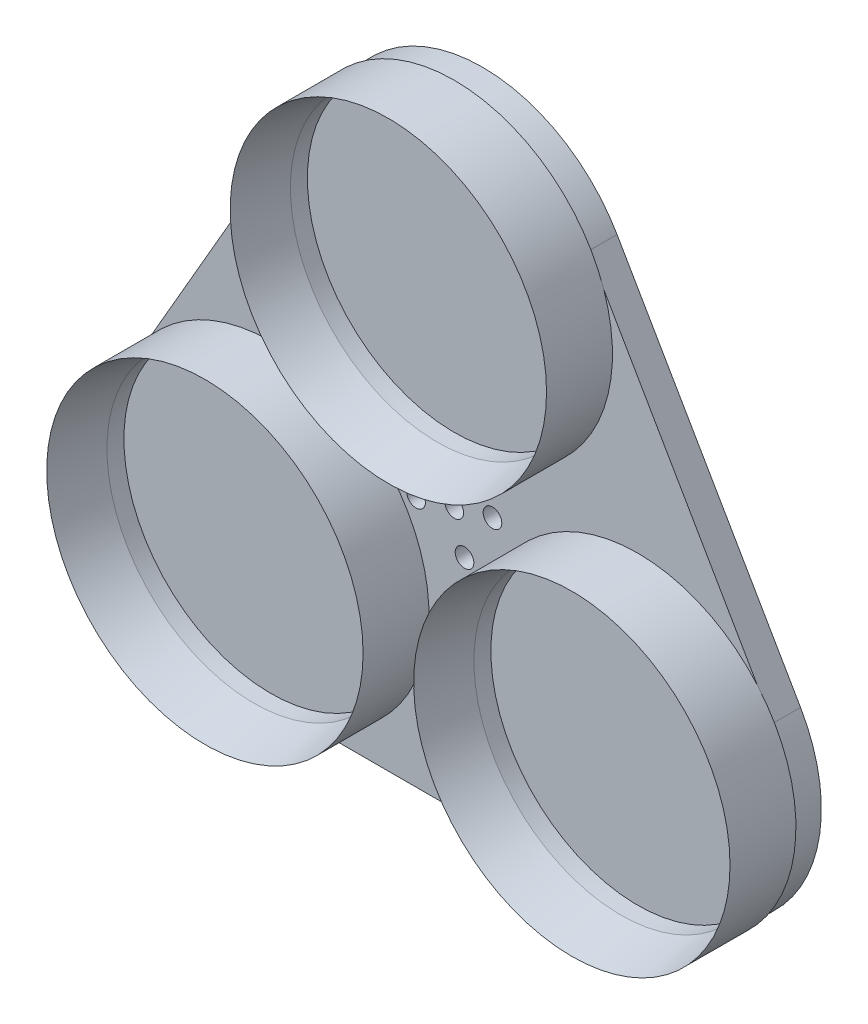
ISO-10303-21;
HEADER;
FILE_DESCRIPTION(('STEP AP214'),'2;1');
FILE_NAME('part.step','',(''),(''),'','','');
FILE_SCHEMA(('AUTOMOTIVE_DESIGN { 1 0 10303 214 1 1 1 1 }'));
ENDSEC;
DATA;
#1=APPLICATION_CONTEXT('core data for automotive mechanical design processes');
#2=APPLICATION_PROTOCOL_DEFINITION('international standard','automotive_design',2000,#1);
#3=PRODUCT_CONTEXT('',#1,'mechanical');
#4=PRODUCT('Part','Part','',(#3));
#5=PRODUCT_RELATED_PRODUCT_CATEGORY('part','',(#4));
#6=PRODUCT_DEFINITION_FORMATION('','',#4);
#7=PRODUCT_DEFINITION_CONTEXT('part definition',#1,'design');
#8=PRODUCT_DEFINITION('design','',#6,#7);
#9=PRODUCT_DEFINITION_SHAPE('','',#8);
#10=(LENGTH_UNIT() NAMED_UNIT(*) SI_UNIT(.MILLI.,.METRE.));
#11=(NAMED_UNIT(*) PLANE_ANGLE_UNIT() SI_UNIT($,.RADIAN.));
#12=(NAMED_UNIT(*) SI_UNIT($,.STERADIAN.) SOLID_ANGLE_UNIT());
#13=UNCERTAINTY_MEASURE_WITH_UNIT(LENGTH_MEASURE(1.E-05),#10,'distance_accuracy_value','');
#14=(GEOMETRIC_REPRESENTATION_CONTEXT(3) GLOBAL_UNCERTAINTY_ASSIGNED_CONTEXT((#13)) GLOBAL_UNIT_ASSIGNED_CONTEXT((#10,
#11,#12)) REPRESENTATION_CONTEXT('',''));
#15=CARTESIAN_POINT('',(0.,0.,0.));
#16=DIRECTION('',(0.,0.,1.));
#17=DIRECTION('',(1.,0.,0.));
#18=AXIS2_PLACEMENT_3D('',#15,#16,#17);
#19=CARTESIAN_POINT('',(0.,37.5,5.));
#20=DIRECTION('',(0.,0.,-1.));
#21=DIRECTION('',(-1.,0.,0.));
#22=AXIS2_PLACEMENT_3D('',#19,#20,#21);
#23=CYLINDRICAL_SURFACE('',#22,27.5);
#24=CARTESIAN_POINT('',(0.,37.5,0.));
#25=DIRECTION('',(0.,0.,1.));
#26=DIRECTION('',(1.,0.,0.));
#27=AXIS2_PLACEMENT_3D('',#24,#25,#26);
#28=CIRCLE('',#27,27.5);
#29=CARTESIAN_POINT('',(23.8156986040722,51.25,0.));
#30=VERTEX_POINT('',#29);
#31=CARTESIAN_POINT('',(-23.8156986040719,51.25,0.));
#32=VERTEX_POINT('',#31);
#33=EDGE_CURVE('E160',#30,#32,#28,.T.);
#34=ORIENTED_EDGE('',*,*,#33,.T.);
#35=DIRECTION('',(0.,0.,-1.));
#36=VECTOR('',#35,1.);
#37=CARTESIAN_POINT('',(-23.8156986040719,51.25,5.));
#38=LINE('',#37,#36);
#39=CARTESIAN_POINT('',(-23.8156986040719,51.25,5.));
#40=VERTEX_POINT('',#39);
#41=EDGE_CURVE('E186',#40,#32,#38,.T.);
#42=ORIENTED_EDGE('',*,*,#41,.F.);
#43=CARTESIAN_POINT('',(0.,37.5,5.));
#44=DIRECTION('',(0.,0.,1.));
#45=DIRECTION('',(1.,0.,0.));
#46=AXIS2_PLACEMENT_3D('',#43,#44,#45);
#47=CIRCLE('',#46,27.5);
#48=CARTESIAN_POINT('',(23.8156986040722,51.25,5.));
#49=VERTEX_POINT('',#48);
#50=EDGE_CURVE('E139',#49,#40,#47,.T.);
#51=ORIENTED_EDGE('',*,*,#50,.F.);
#52=DIRECTION('',(0.,0.,-1.));
#53=VECTOR('',#52,1.);
#54=CARTESIAN_POINT('',(23.8156986040722,51.25,5.));
#55=LINE('',#54,#53);
#56=EDGE_CURVE('E158',#49,#30,#55,.T.);
#57=ORIENTED_EDGE('',*,*,#56,.T.);
#58=EDGE_LOOP('',(#34,#42,#51,#57));
#59=FACE_BOUND('',#58,.T.);
#60=ADVANCED_FACE('F43',(#59),#23,.T.);
#61=CARTESIAN_POINT('',(-23.8156986040719,51.25,5.));
#62=DIRECTION('',(0.866025403784439,-0.5,0.));
#63=DIRECTION('',(0.5,0.866025403784439,0.));
#64=AXIS2_PLACEMENT_3D('',#61,#62,#63);
#65=PLANE('',#64);
#66=DIRECTION('',(-0.5,-0.866025403784439,0.));
#67=VECTOR('',#66,1.);
#68=CARTESIAN_POINT('',(-23.8156986040719,51.25,0.));
#69=LINE('',#68,#67);
#70=CARTESIAN_POINT('',(-56.2916512459884,-5.00000000000011,0.));
#71=VERTEX_POINT('',#70);
#72=EDGE_CURVE('E163',#32,#71,#69,.T.);
#73=ORIENTED_EDGE('',*,*,#72,.T.);
#74=DIRECTION('',(0.,0.,-1.));
#75=VECTOR('',#74,1.);
#76=CARTESIAN_POINT('',(-56.2916512459884,-5.00000000000011,5.));
#77=LINE('',#76,#75);
#78=CARTESIAN_POINT('',(-56.2916512459884,-5.0000000000001,5.));
#79=VERTEX_POINT('',#78);
#80=EDGE_CURVE('E137',#79,#71,#77,.T.);
#81=ORIENTED_EDGE('',*,*,#80,.F.);
#82=DIRECTION('',(-0.5,-0.866025403784439,0.));
#83=VECTOR('',#82,1.);
#84=CARTESIAN_POINT('',(-23.8156986040719,51.25,5.));
#85=LINE('',#84,#83);
#86=CARTESIAN_POINT('',(-53.6577378077752,-0.437928102276289,5.));
#87=VERTEX_POINT('',#86);
#88=EDGE_CURVE('E125',#87,#79,#85,.T.);
#89=ORIENTED_EDGE('',*,*,#88,.F.);
#90=CARTESIAN_POINT('',(-26.4496120422853,46.6879281022761,5.));
#91=VERTEX_POINT('',#90);
#92=EDGE_CURVE('E134',#91,#87,#85,.T.);
#93=ORIENTED_EDGE('',*,*,#92,.F.);
#94=EDGE_CURVE('E141',#40,#91,#85,.T.);
#95=ORIENTED_EDGE('',*,*,#94,.F.);
#96=ORIENTED_EDGE('',*,*,#41,.T.);
#97=EDGE_LOOP('',(#73,#81,#89,#93,#95,#96));
#98=FACE_BOUND('',#97,.T.);
#99=ADVANCED_FACE('F133',(#98),#65,.F.);
#100=CARTESIAN_POINT('',(-32.4759526419164,-18.7500000000001,5.));
#101=DIRECTION('',(0.,0.,-1.));
#102=DIRECTION('',(-1.,0.,0.));
#103=AXIS2_PLACEMENT_3D('',#100,#101,#102);
#104=CYLINDRICAL_SURFACE('',#103,27.5);
#105=CARTESIAN_POINT('',(-32.4759526419164,-18.7500000000001,0.));
#106=DIRECTION('',(0.,0.,1.));
#107=DIRECTION('',(1.,0.,0.));
#108=AXIS2_PLACEMENT_3D('',#105,#106,#107);
#109=CIRCLE('',#108,27.5);
#110=CARTESIAN_POINT('',(-32.4759526419164,-46.2500000000001,0.));
#111=VERTEX_POINT('',#110);
#112=EDGE_CURVE('E166',#71,#111,#109,.T.);
#113=ORIENTED_EDGE('',*,*,#112,.T.);
#114=DIRECTION('',(0.,0.,-1.));
#115=VECTOR('',#114,1.);
#116=CARTESIAN_POINT('',(-32.4759526419164,-46.2500000000001,5.));
#117=LINE('',#116,#115);
#118=CARTESIAN_POINT('',(-32.4759526419164,-46.2500000000001,5.));
#119=VERTEX_POINT('',#118);
#120=EDGE_CURVE('E182',#119,#111,#117,.T.);
#121=ORIENTED_EDGE('',*,*,#120,.F.);
#122=CARTESIAN_POINT('',(-32.4759526419164,-18.7500000000001,5.));
#123=DIRECTION('',(0.,0.,1.));
#124=DIRECTION('',(1.,0.,0.));
#125=AXIS2_PLACEMENT_3D('',#122,#123,#124);
#126=CIRCLE('',#125,27.5);
#127=EDGE_CURVE('E145',#79,#119,#126,.T.);
#128=ORIENTED_EDGE('',*,*,#127,.F.);
#129=ORIENTED_EDGE('',*,*,#80,.T.);
#130=EDGE_LOOP('',(#113,#121,#128,#129));
#131=FACE_BOUND('',#130,.T.);
#132=ADVANCED_FACE('F225',(#131),#104,.T.);
#133=CARTESIAN_POINT('',(-32.4759526419164,-46.2500000000001,5.));
#134=DIRECTION('',(0.,1.,0.));
#135=DIRECTION('',(-1.,0.,0.));
#136=AXIS2_PLACEMENT_3D('',#133,#134,#135);
#137=PLANE('',#136);
#138=DIRECTION('',(1.,0.,0.));
#139=VECTOR('',#138,1.);
#140=CARTESIAN_POINT('',(-32.4759526419164,-46.2500000000001,0.));
#141=LINE('',#140,#139);
#142=CARTESIAN_POINT('',(32.4759526419164,-46.25,0.));
#143=VERTEX_POINT('',#142);
#144=EDGE_CURVE('E168',#111,#143,#141,.T.);
#145=ORIENTED_EDGE('',*,*,#144,.T.);
#146=DIRECTION('',(0.,0.,-1.));
#147=VECTOR('',#146,1.);
#148=CARTESIAN_POINT('',(32.4759526419164,-46.25,5.));
#149=LINE('',#148,#147);
#150=CARTESIAN_POINT('',(32.4759526419164,-46.25,5.));
#151=VERTEX_POINT('',#150);
#152=EDGE_CURVE('E179',#151,#143,#149,.T.);
#153=ORIENTED_EDGE('',*,*,#152,.F.);
#154=DIRECTION('',(1.,0.,0.));
#155=VECTOR('',#154,1.);
#156=CARTESIAN_POINT('',(-32.4759526419164,-46.2500000000001,5.));
#157=LINE('',#156,#155);
#158=CARTESIAN_POINT('',(27.20812576549,-46.25,5.));
#159=VERTEX_POINT('',#158);
#160=EDGE_CURVE('E150',#159,#151,#157,.T.);
#161=ORIENTED_EDGE('',*,*,#160,.F.);
#162=CARTESIAN_POINT('',(-27.20812576549,-46.2500000000001,5.));
#163=VERTEX_POINT('',#162);
#164=EDGE_CURVE('E153',#163,#159,#157,.T.);
#165=ORIENTED_EDGE('',*,*,#164,.F.);
#166=EDGE_CURVE('E128',#119,#163,#157,.T.);
#167=ORIENTED_EDGE('',*,*,#166,.F.);
#168=ORIENTED_EDGE('',*,*,#120,.T.);
#169=EDGE_LOOP('',(#145,#153,#161,#165,#167,#168));
#170=FACE_BOUND('',#169,.T.);
#171=ADVANCED_FACE('F389',(#170),#137,.F.);
#172=CARTESIAN_POINT('',(32.4759526419164,-18.75,5.));
#173=DIRECTION('',(0.,0.,-1.));
#174=DIRECTION('',(-1.,0.,0.));
#175=AXIS2_PLACEMENT_3D('',#172,#173,#174);
#176=CYLINDRICAL_SURFACE('',#175,27.5);
#177=CARTESIAN_POINT('',(32.4759526419164,-18.75,0.));
#178=DIRECTION('',(0.,0.,1.));
#179=DIRECTION('',(1.,0.,0.));
#180=AXIS2_PLACEMENT_3D('',#177,#178,#179);
#181=CIRCLE('',#180,27.5);
#182=CARTESIAN_POINT('',(56.2916512459885,-5.00000000000004,0.));
#183=VERTEX_POINT('',#182);
#184=EDGE_CURVE('E170',#143,#183,#181,.T.);
#185=ORIENTED_EDGE('',*,*,#184,.T.);
#186=DIRECTION('',(0.,0.,-1.));
#187=VECTOR('',#186,1.);
#188=CARTESIAN_POINT('',(56.2916512459885,-5.00000000000004,5.));
#189=LINE('',#188,#187);
#190=CARTESIAN_POINT('',(56.2916512459885,-5.00000000000004,5.));
#191=VERTEX_POINT('',#190);
#192=EDGE_CURVE('E176',#191,#183,#189,.T.);
#193=ORIENTED_EDGE('',*,*,#192,.F.);
#194=CARTESIAN_POINT('',(32.4759526419164,-18.75,5.));
#195=DIRECTION('',(0.,0.,1.));
#196=DIRECTION('',(1.,0.,0.));
#197=AXIS2_PLACEMENT_3D('',#194,#195,#196);
#198=CIRCLE('',#197,27.5);
#199=EDGE_CURVE('E152',#151,#191,#198,.T.);
#200=ORIENTED_EDGE('',*,*,#199,.F.);
#201=ORIENTED_EDGE('',*,*,#152,.T.);
#202=EDGE_LOOP('',(#185,#193,#200,#201));
#203=FACE_BOUND('',#202,.T.);
#204=ADVANCED_FACE('F283',(#203),#176,.T.);
#205=CARTESIAN_POINT('',(56.2916512459885,-5.00000000000003,5.));
#206=DIRECTION('',(-0.866025403784439,-0.499999999999999,0.));
#207=DIRECTION('',(0.499999999999999,-0.866025403784439,0.));
#208=AXIS2_PLACEMENT_3D('',#205,#206,#207);
#209=PLANE('',#208);
#210=DIRECTION('',(-0.499999999999999,0.866025403784439,0.));
#211=VECTOR('',#210,1.);
#212=CARTESIAN_POINT('',(56.2916512459885,-5.00000000000003,0.));
#213=LINE('',#212,#211);
#214=EDGE_CURVE('E172',#183,#30,#213,.T.);
#215=ORIENTED_EDGE('',*,*,#214,.T.);
#216=ORIENTED_EDGE('',*,*,#56,.F.);
#217=DIRECTION('',(-0.499999999999999,0.866025403784439,0.));
#218=VECTOR('',#217,1.);
#219=CARTESIAN_POINT('',(56.2916512459885,-5.00000000000003,5.));
#220=LINE('',#219,#218);
#221=CARTESIAN_POINT('',(26.4496120422854,46.6879281022762,5.));
#222=VERTEX_POINT('',#221);
#223=EDGE_CURVE('E155',#222,#49,#220,.T.);
#224=ORIENTED_EDGE('',*,*,#223,.F.);
#225=CARTESIAN_POINT('',(53.6577378077753,-0.437928102276252,5.));
#226=VERTEX_POINT('',#225);
#227=EDGE_CURVE('E159',#226,#222,#220,.T.);
#228=ORIENTED_EDGE('',*,*,#227,.F.);
#229=EDGE_CURVE('E156',#191,#226,#220,.T.);
#230=ORIENTED_EDGE('',*,*,#229,.F.);
#231=ORIENTED_EDGE('',*,*,#192,.T.);
#232=EDGE_LOOP('',(#215,#216,#224,#228,#230,#231));
#233=FACE_BOUND('',#232,.T.);
#234=ADVANCED_FACE('F275',(#233),#209,.F.);
#235=CARTESIAN_POINT('',(0.,37.5,5.));
#236=DIRECTION('',(0.,0.,1.));
#237=DIRECTION('',(1.,0.,0.));
#238=AXIS2_PLACEMENT_3D('',#235,#236,#237);
#239=PLANE('',#238);
#240=CARTESIAN_POINT('',(-6.76148078402348,-1.81173331571765,5.));
#241=DIRECTION('',(0.,0.,1.));
#242=DIRECTION('',(1.,0.,0.));
#243=AXIS2_PLACEMENT_3D('',#240,#241,#242);
#244=CIRCLE('',#243,1.65);
#245=CARTESIAN_POINT('',(-5.11148078402348,-1.81173331571765,5.));
#246=VERTEX_POINT('',#245);
#247=EDGE_CURVE('E317',#246,#246,#244,.T.);
#248=ORIENTED_EDGE('',*,*,#247,.F.);
#249=EDGE_LOOP('',(#248));
#250=FACE_BOUND('',#249,.T.);
#251=CARTESIAN_POINT('',(1.81173331571763,-6.76148078402348,5.));
#252=DIRECTION('',(0.,0.,1.));
#253=DIRECTION('',(1.,0.,0.));
#254=AXIS2_PLACEMENT_3D('',#251,#252,#253);
#255=CIRCLE('',#254,1.65000000000001);
#256=CARTESIAN_POINT('',(3.46173331571763,-6.76148078402348,5.));
#257=VERTEX_POINT('',#256);
#258=EDGE_CURVE('E323',#257,#257,#255,.T.);
#259=ORIENTED_EDGE('',*,*,#258,.F.);
#260=EDGE_LOOP('',(#259));
#261=FACE_BOUND('',#260,.T.);
#262=CARTESIAN_POINT('',(6.76148078402348,1.81173331571765,5.));
#263=DIRECTION('',(0.,0.,1.));
#264=DIRECTION('',(1.,0.,0.));
#265=AXIS2_PLACEMENT_3D('',#262,#263,#264);
#266=CIRCLE('',#265,1.65000000000002);
#267=CARTESIAN_POINT('',(8.4114807840235,1.81173331571765,5.));
#268=VERTEX_POINT('',#267);
#269=EDGE_CURVE('E329',#268,#268,#266,.T.);
#270=ORIENTED_EDGE('',*,*,#269,.F.);
#271=EDGE_LOOP('',(#270));
#272=FACE_BOUND('',#271,.T.);
#273=CARTESIAN_POINT('',(-1.81173331571763,6.76148078402348,5.));
#274=DIRECTION('',(0.,0.,1.));
#275=DIRECTION('',(1.,0.,0.));
#276=AXIS2_PLACEMENT_3D('',#273,#274,#275);
#277=CIRCLE('',#276,1.65);
#278=CARTESIAN_POINT('',(-0.161733315717626,6.76148078402348,5.));
#279=VERTEX_POINT('',#278);
#280=EDGE_CURVE('E311',#279,#279,#277,.T.);
#281=ORIENTED_EDGE('',*,*,#280,.F.);
#282=EDGE_LOOP('',(#281));
#283=FACE_BOUND('',#282,.T.);
#284=CARTESIAN_POINT('',(0.,0.,5.));
#285=DIRECTION('',(0.,0.,1.));
#286=DIRECTION('',(1.,0.,0.));
#287=AXIS2_PLACEMENT_3D('',#284,#285,#286);
#288=CIRCLE('',#287,1.65);
#289=CARTESIAN_POINT('',(1.65,0.,5.));
#290=VERTEX_POINT('',#289);
#291=EDGE_CURVE('E308',#290,#290,#288,.T.);
#292=ORIENTED_EDGE('',*,*,#291,.F.);
#293=EDGE_LOOP('',(#292));
#294=FACE_BOUND('',#293,.T.);
#295=ORIENTED_EDGE('',*,*,#92,.T.);
#296=CARTESIAN_POINT('',(-32.4759526419164,-18.7500000000001,5.));
#297=DIRECTION('',(0.,0.,1.));
#298=DIRECTION('',(1.,0.,0.));
#299=AXIS2_PLACEMENT_3D('',#296,#297,#298);
#300=CIRCLE('',#299,28.);
#301=EDGE_CURVE('E114',#87,#163,#300,.F.);
#302=ORIENTED_EDGE('',*,*,#301,.T.);
#303=ORIENTED_EDGE('',*,*,#164,.T.);
#304=CARTESIAN_POINT('',(32.4759526419164,-18.75,5.));
#305=DIRECTION('',(0.,0.,1.));
#306=DIRECTION('',(1.,0.,0.));
#307=AXIS2_PLACEMENT_3D('',#304,#305,#306);
#308=CIRCLE('',#307,28.);
#309=EDGE_CURVE('E303',#226,#159,#308,.T.);
#310=ORIENTED_EDGE('',*,*,#309,.F.);
#311=ORIENTED_EDGE('',*,*,#227,.T.);
#312=CARTESIAN_POINT('',(0.,37.5,5.));
#313=DIRECTION('',(0.,0.,1.));
#314=DIRECTION('',(1.,0.,0.));
#315=AXIS2_PLACEMENT_3D('',#312,#313,#314);
#316=CIRCLE('',#315,28.);
#317=EDGE_CURVE('E144',#91,#222,#316,.T.);
#318=ORIENTED_EDGE('',*,*,#317,.F.);
#319=EDGE_LOOP('',(#295,#302,#303,#310,#311,#318));
#320=FACE_BOUND('',#319,.T.);
#321=ADVANCED_FACE('F142',(#250,#261,#272,#283,#294,#320),#239,.T.);
#322=CARTESIAN_POINT('',(0.,37.5,0.));
#323=DIRECTION('',(0.,0.,1.));
#324=DIRECTION('',(1.,0.,0.));
#325=AXIS2_PLACEMENT_3D('',#322,#323,#324);
#326=PLANE('',#325);
#327=CARTESIAN_POINT('',(-6.76148078402348,-1.81173331571765,0.));
#328=DIRECTION('',(0.,0.,1.));
#329=DIRECTION('',(1.,0.,0.));
#330=AXIS2_PLACEMENT_3D('',#327,#328,#329);
#331=CIRCLE('',#330,1.65);
#332=CARTESIAN_POINT('',(-5.11148078402348,-1.81173331571765,0.));
#333=VERTEX_POINT('',#332);
#334=EDGE_CURVE('E314',#333,#333,#331,.T.);
#335=ORIENTED_EDGE('',*,*,#334,.T.);
#336=EDGE_LOOP('',(#335));
#337=FACE_BOUND('',#336,.T.);
#338=CARTESIAN_POINT('',(1.81173331571763,-6.76148078402348,0.));
#339=DIRECTION('',(0.,0.,1.));
#340=DIRECTION('',(1.,0.,0.));
#341=AXIS2_PLACEMENT_3D('',#338,#339,#340);
#342=CIRCLE('',#341,1.65000000000001);
#343=CARTESIAN_POINT('',(3.46173331571763,-6.76148078402348,0.));
#344=VERTEX_POINT('',#343);
#345=EDGE_CURVE('E320',#344,#344,#342,.T.);
#346=ORIENTED_EDGE('',*,*,#345,.T.);
#347=EDGE_LOOP('',(#346));
#348=FACE_BOUND('',#347,.T.);
#349=CARTESIAN_POINT('',(6.76148078402348,1.81173331571765,0.));
#350=DIRECTION('',(0.,0.,1.));
#351=DIRECTION('',(1.,0.,0.));
#352=AXIS2_PLACEMENT_3D('',#349,#350,#351);
#353=CIRCLE('',#352,1.65000000000002);
#354=CARTESIAN_POINT('',(8.4114807840235,1.81173331571765,0.));
#355=VERTEX_POINT('',#354);
#356=EDGE_CURVE('E326',#355,#355,#353,.T.);
#357=ORIENTED_EDGE('',*,*,#356,.T.);
#358=EDGE_LOOP('',(#357));
#359=FACE_BOUND('',#358,.T.);
#360=CARTESIAN_POINT('',(-1.81173331571763,6.76148078402348,0.));
#361=DIRECTION('',(0.,0.,1.));
#362=DIRECTION('',(1.,0.,0.));
#363=AXIS2_PLACEMENT_3D('',#360,#361,#362);
#364=CIRCLE('',#363,1.65);
#365=CARTESIAN_POINT('',(-0.161733315717626,6.76148078402348,0.));
#366=VERTEX_POINT('',#365);
#367=EDGE_CURVE('E332',#366,#366,#364,.T.);
#368=ORIENTED_EDGE('',*,*,#367,.T.);
#369=EDGE_LOOP('',(#368));
#370=FACE_BOUND('',#369,.T.);
#371=CARTESIAN_POINT('',(0.,0.,0.));
#372=DIRECTION('',(0.,0.,1.));
#373=DIRECTION('',(1.,0.,0.));
#374=AXIS2_PLACEMENT_3D('',#371,#372,#373);
#375=CIRCLE('',#374,1.65);
#376=CARTESIAN_POINT('',(1.65,0.,0.));
#377=VERTEX_POINT('',#376);
#378=EDGE_CURVE('E129',#377,#377,#375,.T.);
#379=ORIENTED_EDGE('',*,*,#378,.T.);
#380=EDGE_LOOP('',(#379));
#381=FACE_BOUND('',#380,.T.);
#382=ORIENTED_EDGE('',*,*,#33,.F.);
#383=ORIENTED_EDGE('',*,*,#214,.F.);
#384=ORIENTED_EDGE('',*,*,#184,.F.);
#385=ORIENTED_EDGE('',*,*,#144,.F.);
#386=ORIENTED_EDGE('',*,*,#112,.F.);
#387=ORIENTED_EDGE('',*,*,#72,.F.);
#388=EDGE_LOOP('',(#382,#383,#384,#385,#386,#387));
#389=FACE_BOUND('',#388,.T.);
#390=ADVANCED_FACE('F274',(#337,#348,#359,#370,#381,#389),#326,.F.);
#391=CARTESIAN_POINT('',(0.,37.5,5.));
#392=DIRECTION('',(0.,0.,1.));
#393=DIRECTION('',(1.,0.,0.));
#394=AXIS2_PLACEMENT_3D('',#391,#392,#393);
#395=PLANE('',#394);
#396=ORIENTED_EDGE('',*,*,#50,.T.);
#397=ORIENTED_EDGE('',*,*,#94,.T.);
#398=EDGE_CURVE('E164',#222,#91,#316,.T.);
#399=ORIENTED_EDGE('',*,*,#398,.F.);
#400=ORIENTED_EDGE('',*,*,#223,.T.);
#401=EDGE_LOOP('',(#396,#397,#399,#400));
#402=FACE_BOUND('',#401,.T.);
#403=ADVANCED_FACE('F281',(#402),#395,.F.);
#404=CARTESIAN_POINT('',(0.,37.5,21.));
#405=DIRECTION('',(0.,0.,-1.));
#406=DIRECTION('',(-1.,0.,0.));
#407=AXIS2_PLACEMENT_3D('',#404,#405,#406);
#408=CYLINDRICAL_SURFACE('',#407,28.);
#409=CARTESIAN_POINT('',(0.,37.5,16.6666666666664));
#410=DIRECTION('',(0.,0.,1.));
#411=DIRECTION('',(1.,0.,0.));
#412=AXIS2_PLACEMENT_3D('',#409,#410,#411);
#413=CIRCLE('',#412,28.);
#414=CARTESIAN_POINT('',(28.0000000000001,37.5,16.6666666666664));
#415=VERTEX_POINT('',#414);
#416=EDGE_CURVE('E11',#415,#415,#413,.F.);
#417=ORIENTED_EDGE('',*,*,#416,.T.);
#418=EDGE_LOOP('',(#417));
#419=FACE_BOUND('',#418,.T.);
#420=ORIENTED_EDGE('',*,*,#398,.T.);
#421=ORIENTED_EDGE('',*,*,#317,.T.);
#422=EDGE_LOOP('',(#420,#421));
#423=FACE_BOUND('',#422,.T.);
#424=ADVANCED_FACE('F298',(#419,#423),#408,.T.);
#425=CARTESIAN_POINT('',(0.,37.5,21.));
#426=DIRECTION('',(0.,0.,-1.));
#427=DIRECTION('',(-1.,0.,0.));
#428=AXIS2_PLACEMENT_3D('',#425,#426,#427);
#429=CYLINDRICAL_SURFACE('',#428,26.);
#430=CARTESIAN_POINT('',(0.,37.5,7.99999999999998));
#431=DIRECTION('',(0.,0.,1.));
#432=DIRECTION('',(1.,0.,0.));
#433=AXIS2_PLACEMENT_3D('',#430,#431,#432);
#434=CIRCLE('',#433,26.);
#435=CARTESIAN_POINT('',(26.0000000000001,37.5,7.99999999999998));
#436=VERTEX_POINT('',#435);
#437=EDGE_CURVE('E52',#436,#436,#434,.T.);
#438=ORIENTED_EDGE('',*,*,#437,.T.);
#439=EDGE_LOOP('',(#438));
#440=FACE_BOUND('',#439,.T.);
#441=CARTESIAN_POINT('',(0.,37.5,5.));
#442=DIRECTION('',(0.,0.,1.));
#443=DIRECTION('',(1.,0.,0.));
#444=AXIS2_PLACEMENT_3D('',#441,#442,#443);
#445=CIRCLE('',#444,26.);
#446=CARTESIAN_POINT('',(26.0000000000001,37.5,5.));
#447=VERTEX_POINT('',#446);
#448=EDGE_CURVE('E302',#447,#447,#445,.T.);
#449=ORIENTED_EDGE('',*,*,#448,.F.);
#450=EDGE_LOOP('',(#449));
#451=FACE_BOUND('',#450,.T.);
#452=ADVANCED_FACE('F207',(#440,#451),#429,.F.);
#453=ORIENTED_EDGE('',*,*,#448,.T.);
#454=EDGE_LOOP('',(#453));
#455=FACE_BOUND('',#454,.T.);
#456=ADVANCED_FACE('F272',(#455),#239,.T.);
#457=CARTESIAN_POINT('',(32.4759526419164,-18.75,5.));
#458=DIRECTION('',(0.,0.,1.));
#459=DIRECTION('',(1.,0.,0.));
#460=AXIS2_PLACEMENT_3D('',#457,#458,#459);
#461=PLANE('',#460);
#462=EDGE_CURVE('E65',#159,#226,#308,.T.);
#463=ORIENTED_EDGE('',*,*,#462,.F.);
#464=ORIENTED_EDGE('',*,*,#160,.T.);
#465=ORIENTED_EDGE('',*,*,#199,.T.);
#466=ORIENTED_EDGE('',*,*,#229,.T.);
#467=EDGE_LOOP('',(#463,#464,#465,#466));
#468=FACE_BOUND('',#467,.T.);
#469=ADVANCED_FACE('F289',(#468),#461,.F.);
#470=CARTESIAN_POINT('',(32.4759526419164,-18.75,21.));
#471=DIRECTION('',(0.,0.,-1.));
#472=DIRECTION('',(-1.,0.,0.));
#473=AXIS2_PLACEMENT_3D('',#470,#471,#472);
#474=CYLINDRICAL_SURFACE('',#473,28.);
#475=CARTESIAN_POINT('',(32.4759526419164,-18.75,16.6666666666665));
#476=DIRECTION('',(0.,0.,1.));
#477=DIRECTION('',(1.,0.,0.));
#478=AXIS2_PLACEMENT_3D('',#475,#476,#477);
#479=CIRCLE('',#478,28.);
#480=CARTESIAN_POINT('',(60.4759526419165,-18.75,16.6666666666665));
#481=VERTEX_POINT('',#480);
#482=EDGE_CURVE('E202',#481,#481,#479,.F.);
#483=ORIENTED_EDGE('',*,*,#482,.T.);
#484=EDGE_LOOP('',(#483));
#485=FACE_BOUND('',#484,.T.);
#486=ORIENTED_EDGE('',*,*,#309,.T.);
#487=ORIENTED_EDGE('',*,*,#462,.T.);
#488=EDGE_LOOP('',(#486,#487));
#489=FACE_BOUND('',#488,.T.);
#490=ADVANCED_FACE('F295',(#485,#489),#474,.T.);
#491=CARTESIAN_POINT('',(32.4759526419164,-18.75,21.));
#492=DIRECTION('',(0.,0.,-1.));
#493=DIRECTION('',(-1.,0.,0.));
#494=AXIS2_PLACEMENT_3D('',#491,#492,#493);
#495=CYLINDRICAL_SURFACE('',#494,26.);
#496=CARTESIAN_POINT('',(32.4759526419164,-18.75,7.99999999999998));
#497=DIRECTION('',(0.,0.,1.));
#498=DIRECTION('',(1.,0.,0.));
#499=AXIS2_PLACEMENT_3D('',#496,#497,#498);
#500=CIRCLE('',#499,26.);
#501=CARTESIAN_POINT('',(58.4759526419164,-18.75,7.99999999999998));
#502=VERTEX_POINT('',#501);
#503=EDGE_CURVE('E199',#502,#502,#500,.T.);
#504=ORIENTED_EDGE('',*,*,#503,.T.);
#505=EDGE_LOOP('',(#504));
#506=FACE_BOUND('',#505,.T.);
#507=CARTESIAN_POINT('',(32.4759526419164,-18.75,5.));
#508=DIRECTION('',(0.,0.,1.));
#509=DIRECTION('',(1.,0.,0.));
#510=AXIS2_PLACEMENT_3D('',#507,#508,#509);
#511=CIRCLE('',#510,26.);
#512=CARTESIAN_POINT('',(58.4759526419164,-18.75,5.));
#513=VERTEX_POINT('',#512);
#514=EDGE_CURVE('E189',#513,#513,#511,.F.);
#515=ORIENTED_EDGE('',*,*,#514,.T.);
#516=EDGE_LOOP('',(#515));
#517=FACE_BOUND('',#516,.T.);
#518=ADVANCED_FACE('F270',(#506,#517),#495,.F.);
#519=ORIENTED_EDGE('',*,*,#514,.F.);
#520=EDGE_LOOP('',(#519));
#521=FACE_BOUND('',#520,.T.);
#522=ADVANCED_FACE('F260',(#521),#239,.T.);
#523=CARTESIAN_POINT('',(-32.4759526419164,-18.7500000000001,5.));
#524=DIRECTION('',(0.,0.,1.));
#525=DIRECTION('',(1.,0.,0.));
#526=AXIS2_PLACEMENT_3D('',#523,#524,#525);
#527=PLANE('',#526);
#528=CARTESIAN_POINT('',(-32.4759526419164,-18.7500000000001,5.));
#529=DIRECTION('',(0.,0.,1.));
#530=DIRECTION('',(1.,0.,0.));
#531=AXIS2_PLACEMENT_3D('',#528,#529,#530);
#532=CIRCLE('',#531,28.);
#533=EDGE_CURVE('E58',#87,#163,#532,.T.);
#534=ORIENTED_EDGE('',*,*,#533,.F.);
#535=ORIENTED_EDGE('',*,*,#88,.T.);
#536=ORIENTED_EDGE('',*,*,#127,.T.);
#537=ORIENTED_EDGE('',*,*,#166,.T.);
#538=EDGE_LOOP('',(#534,#535,#536,#537));
#539=FACE_BOUND('',#538,.T.);
#540=ADVANCED_FACE('F124',(#539),#527,.F.);
#541=CARTESIAN_POINT('',(-32.4759526419164,-18.7500000000001,21.));
#542=DIRECTION('',(0.,0.,-1.));
#543=DIRECTION('',(-1.,0.,0.));
#544=AXIS2_PLACEMENT_3D('',#541,#542,#543);
#545=CYLINDRICAL_SURFACE('',#544,28.);
#546=CARTESIAN_POINT('',(-32.4759526419164,-18.7500000000001,16.6666666666664));
#547=DIRECTION('',(0.,0.,1.));
#548=DIRECTION('',(1.,0.,0.));
#549=AXIS2_PLACEMENT_3D('',#546,#547,#548);
#550=CIRCLE('',#549,28.);
#551=CARTESIAN_POINT('',(-4.4759526419164,-18.7500000000001,16.6666666666664));
#552=VERTEX_POINT('',#551);
#553=EDGE_CURVE('E196',#552,#552,#550,.F.);
#554=ORIENTED_EDGE('',*,*,#553,.T.);
#555=EDGE_LOOP('',(#554));
#556=FACE_BOUND('',#555,.T.);
#557=ORIENTED_EDGE('',*,*,#533,.T.);
#558=ORIENTED_EDGE('',*,*,#301,.F.);
#559=EDGE_LOOP('',(#557,#558));
#560=FACE_BOUND('',#559,.T.);
#561=ADVANCED_FACE('F115',(#556,#560),#545,.T.);
#562=CARTESIAN_POINT('',(-32.4759526419164,-18.7500000000001,21.));
#563=DIRECTION('',(0.,0.,-1.));
#564=DIRECTION('',(-1.,0.,0.));
#565=AXIS2_PLACEMENT_3D('',#562,#563,#564);
#566=CYLINDRICAL_SURFACE('',#565,26.);
#567=CARTESIAN_POINT('',(-32.4759526419164,-18.7500000000001,7.99999999999998));
#568=DIRECTION('',(0.,0.,1.));
#569=DIRECTION('',(1.,0.,0.));
#570=AXIS2_PLACEMENT_3D('',#567,#568,#569);
#571=CIRCLE('',#570,26.);
#572=CARTESIAN_POINT('',(-6.4759526419164,-18.7500000000001,7.99999999999998));
#573=VERTEX_POINT('',#572);
#574=EDGE_CURVE('E119',#573,#573,#571,.T.);
#575=ORIENTED_EDGE('',*,*,#574,.T.);
#576=EDGE_LOOP('',(#575));
#577=FACE_BOUND('',#576,.T.);
#578=CARTESIAN_POINT('',(-32.4759526419164,-18.7500000000001,5.));
#579=DIRECTION('',(0.,0.,1.));
#580=DIRECTION('',(1.,0.,0.));
#581=AXIS2_PLACEMENT_3D('',#578,#579,#580);
#582=CIRCLE('',#581,26.);
#583=CARTESIAN_POINT('',(-6.4759526419164,-18.7500000000001,5.));
#584=VERTEX_POINT('',#583);
#585=EDGE_CURVE('E120',#584,#584,#582,.F.);
#586=ORIENTED_EDGE('',*,*,#585,.T.);
#587=EDGE_LOOP('',(#586));
#588=FACE_BOUND('',#587,.T.);
#589=ADVANCED_FACE('F250',(#577,#588),#566,.F.);
#590=ORIENTED_EDGE('',*,*,#585,.F.);
#591=EDGE_LOOP('',(#590));
#592=FACE_BOUND('',#591,.T.);
#593=ADVANCED_FACE('F253',(#592),#239,.T.);
#594=CARTESIAN_POINT('',(0.,0.,0.));
#595=DIRECTION('',(0.,0.,1.));
#596=DIRECTION('',(1.,0.,0.));
#597=AXIS2_PLACEMENT_3D('',#594,#595,#596);
#598=CYLINDRICAL_SURFACE('',#597,1.65);
#599=ORIENTED_EDGE('',*,*,#378,.F.);
#600=EDGE_LOOP('',(#599));
#601=FACE_BOUND('',#600,.T.);
#602=ORIENTED_EDGE('',*,*,#291,.T.);
#603=EDGE_LOOP('',(#602));
#604=FACE_BOUND('',#603,.T.);
#605=ADVANCED_FACE('F258',(#601,#604),#598,.F.);
#606=CARTESIAN_POINT('',(-1.81173331571763,6.76148078402348,0.));
#607=DIRECTION('',(0.,0.,1.));
#608=DIRECTION('',(1.,0.,0.));
#609=AXIS2_PLACEMENT_3D('',#606,#607,#608);
#610=CYLINDRICAL_SURFACE('',#609,1.65);
#611=ORIENTED_EDGE('',*,*,#367,.F.);
#612=EDGE_LOOP('',(#611));
#613=FACE_BOUND('',#612,.T.);
#614=ORIENTED_EDGE('',*,*,#280,.T.);
#615=EDGE_LOOP('',(#614));
#616=FACE_BOUND('',#615,.T.);
#617=ADVANCED_FACE('F264',(#613,#616),#610,.F.);
#618=CARTESIAN_POINT('',(6.76148078402348,1.81173331571765,0.));
#619=DIRECTION('',(0.,0.,1.));
#620=DIRECTION('',(1.,0.,0.));
#621=AXIS2_PLACEMENT_3D('',#618,#619,#620);
#622=CYLINDRICAL_SURFACE('',#621,1.65000000000002);
#623=ORIENTED_EDGE('',*,*,#356,.F.);
#624=EDGE_LOOP('',(#623));
#625=FACE_BOUND('',#624,.T.);
#626=ORIENTED_EDGE('',*,*,#269,.T.);
#627=EDGE_LOOP('',(#626));
#628=FACE_BOUND('',#627,.T.);
#629=ADVANCED_FACE('F343',(#625,#628),#622,.F.);
#630=CARTESIAN_POINT('',(1.81173331571763,-6.76148078402348,0.));
#631=DIRECTION('',(0.,0.,1.));
#632=DIRECTION('',(1.,0.,0.));
#633=AXIS2_PLACEMENT_3D('',#630,#631,#632);
#634=CYLINDRICAL_SURFACE('',#633,1.65000000000001);
#635=ORIENTED_EDGE('',*,*,#345,.F.);
#636=EDGE_LOOP('',(#635));
#637=FACE_BOUND('',#636,.T.);
#638=ORIENTED_EDGE('',*,*,#258,.T.);
#639=EDGE_LOOP('',(#638));
#640=FACE_BOUND('',#639,.T.);
#641=ADVANCED_FACE('F243',(#637,#640),#634,.F.);
#642=CARTESIAN_POINT('',(-6.76148078402348,-1.81173331571765,0.));
#643=DIRECTION('',(0.,0.,1.));
#644=DIRECTION('',(1.,0.,0.));
#645=AXIS2_PLACEMENT_3D('',#642,#643,#644);
#646=CYLINDRICAL_SURFACE('',#645,1.65);
#647=ORIENTED_EDGE('',*,*,#334,.F.);
#648=EDGE_LOOP('',(#647));
#649=FACE_BOUND('',#648,.T.);
#650=ORIENTED_EDGE('',*,*,#247,.T.);
#651=EDGE_LOOP('',(#650));
#652=FACE_BOUND('',#651,.T.);
#653=ADVANCED_FACE('F234',(#649,#652),#646,.F.);
#654=CARTESIAN_POINT('',(-32.4759526419164,-18.7500000000001,7.99999999999998));
#655=DIRECTION('',(0.,0.,1.));
#656=DIRECTION('',(1.,0.,0.));
#657=AXIS2_PLACEMENT_3D('',#654,#655,#656);
#658=CONICAL_SURFACE('',#657,26.,0.226798848053892);
#659=ORIENTED_EDGE('',*,*,#553,.F.);
#660=EDGE_LOOP('',(#659));
#661=FACE_BOUND('',#660,.T.);
#662=ORIENTED_EDGE('',*,*,#574,.F.);
#663=EDGE_LOOP('',(#662));
#664=FACE_BOUND('',#663,.T.);
#665=ADVANCED_FACE('F216',(#661,#664),#658,.F.);
#666=CARTESIAN_POINT('',(32.4759526419164,-18.75,7.99999999999998));
#667=DIRECTION('',(0.,0.,1.));
#668=DIRECTION('',(1.,0.,0.));
#669=AXIS2_PLACEMENT_3D('',#666,#667,#668);
#670=CONICAL_SURFACE('',#669,26.,0.226798848053892);
#671=ORIENTED_EDGE('',*,*,#482,.F.);
#672=EDGE_LOOP('',(#671));
#673=FACE_BOUND('',#672,.T.);
#674=ORIENTED_EDGE('',*,*,#503,.F.);
#675=EDGE_LOOP('',(#674));
#676=FACE_BOUND('',#675,.T.);
#677=ADVANCED_FACE('F211',(#673,#676),#670,.F.);
#678=CARTESIAN_POINT('',(0.,37.5,7.99999999999998));
#679=DIRECTION('',(0.,0.,1.));
#680=DIRECTION('',(1.,0.,0.));
#681=AXIS2_PLACEMENT_3D('',#678,#679,#680);
#682=CONICAL_SURFACE('',#681,26.,0.226798848053892);
#683=ORIENTED_EDGE('',*,*,#416,.F.);
#684=EDGE_LOOP('',(#683));
#685=FACE_BOUND('',#684,.T.);
#686=ORIENTED_EDGE('',*,*,#437,.F.);
#687=EDGE_LOOP('',(#686));
#688=FACE_BOUND('',#687,.T.);
#689=ADVANCED_FACE('F46',(#685,#688),#682,.F.);
#690=CLOSED_SHELL('',(#60,#99,#132,#171,#204,#234,#321,#390,#403,#424,#452,#456,#469,#490,#518,
#522,#540,#561,#589,#593,#605,#617,#629,#641,#653,#665,#677,#689));
#691=MANIFOLD_SOLID_BREP('B2',#690);
#692=ADVANCED_BREP_SHAPE_REPRESENTATION('',(#18,#691),#14);
#693=SHAPE_DEFINITION_REPRESENTATION(#9,#692);
ENDSEC;
END-ISO-10303-21;
